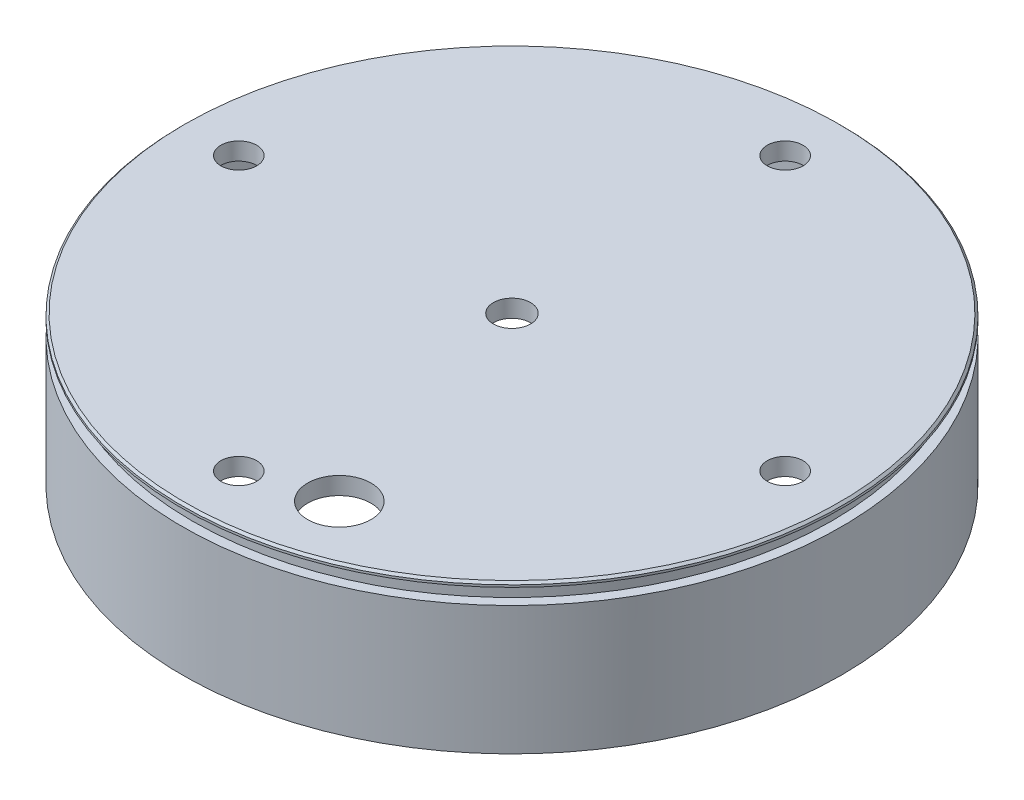
ISO-10303-21;
HEADER;
FILE_DESCRIPTION(('STEP AP214'),'2;1');
FILE_NAME('part.step','',(''),(''),'','','');
FILE_SCHEMA(('AUTOMOTIVE_DESIGN { 1 0 10303 214 1 1 1 1 }'));
ENDSEC;
DATA;
#1=APPLICATION_CONTEXT('core data for automotive mechanical design processes');
#2=APPLICATION_PROTOCOL_DEFINITION('international standard','automotive_design',2000,#1);
#3=PRODUCT_CONTEXT('',#1,'mechanical');
#4=PRODUCT('Part','Part','',(#3));
#5=PRODUCT_RELATED_PRODUCT_CATEGORY('part','',(#4));
#6=PRODUCT_DEFINITION_FORMATION('','',#4);
#7=PRODUCT_DEFINITION_CONTEXT('part definition',#1,'design');
#8=PRODUCT_DEFINITION('design','',#6,#7);
#9=PRODUCT_DEFINITION_SHAPE('','',#8);
#10=(LENGTH_UNIT() NAMED_UNIT(*) SI_UNIT(.MILLI.,.METRE.));
#11=(NAMED_UNIT(*) PLANE_ANGLE_UNIT() SI_UNIT($,.RADIAN.));
#12=(NAMED_UNIT(*) SI_UNIT($,.STERADIAN.) SOLID_ANGLE_UNIT());
#13=UNCERTAINTY_MEASURE_WITH_UNIT(LENGTH_MEASURE(1.E-05),#10,'distance_accuracy_value','');
#14=(GEOMETRIC_REPRESENTATION_CONTEXT(3) GLOBAL_UNCERTAINTY_ASSIGNED_CONTEXT((#13)) GLOBAL_UNIT_ASSIGNED_CONTEXT((#10,
#11,#12)) REPRESENTATION_CONTEXT('',''));
#15=CARTESIAN_POINT('',(0.,0.,0.));
#16=DIRECTION('',(0.,0.,1.));
#17=DIRECTION('',(1.,0.,0.));
#18=AXIS2_PLACEMENT_3D('',#15,#16,#17);
#19=CARTESIAN_POINT('',(0.,-30.,0.));
#20=DIRECTION('',(0.,1.,0.));
#21=DIRECTION('',(1.,0.,0.));
#22=AXIS2_PLACEMENT_3D('',#19,#20,#21);
#23=PLANE('',#22);
#24=CARTESIAN_POINT('',(0.,-30.,0.));
#25=DIRECTION('',(0.,1.,0.));
#26=DIRECTION('',(-1.,0.,0.));
#27=AXIS2_PLACEMENT_3D('',#24,#25,#26);
#28=CIRCLE('',#27,73.39);
#29=CARTESIAN_POINT('',(73.39,-30.,0.));
#30=VERTEX_POINT('',#29);
#31=EDGE_CURVE('E11',#30,#30,#28,.T.);
#32=ORIENTED_EDGE('',*,*,#31,.T.);
#33=EDGE_LOOP('',(#32));
#34=FACE_BOUND('',#33,.T.);
#35=CARTESIAN_POINT('',(0.,-30.,0.));
#36=DIRECTION('',(0.,-1.,0.));
#37=DIRECTION('',(-1.,0.,0.));
#38=AXIS2_PLACEMENT_3D('',#35,#36,#37);
#39=CIRCLE('',#38,75.39);
#40=CARTESIAN_POINT('',(75.39,-30.,0.));
#41=VERTEX_POINT('',#40);
#42=CARTESIAN_POINT('',(-75.39,-30.,0.));
#43=VERTEX_POINT('',#42);
#44=EDGE_CURVE('E178',#41,#43,#39,.T.);
#45=ORIENTED_EDGE('',*,*,#44,.T.);
#46=CARTESIAN_POINT('',(0.,-30.,0.));
#47=DIRECTION('',(0.,-1.,0.));
#48=DIRECTION('',(-1.,0.,0.));
#49=AXIS2_PLACEMENT_3D('',#46,#47,#48);
#50=CIRCLE('',#49,75.39);
#51=EDGE_CURVE('E169',#43,#41,#50,.T.);
#52=ORIENTED_EDGE('',*,*,#51,.T.);
#53=EDGE_LOOP('',(#45,#52));
#54=FACE_BOUND('',#53,.T.);
#55=ADVANCED_FACE('F16',(#34,#54),#23,.F.);
#56=CARTESIAN_POINT('',(0.,0.,0.));
#57=DIRECTION('',(0.,1.,0.));
#58=DIRECTION('',(1.,0.,0.));
#59=AXIS2_PLACEMENT_3D('',#56,#57,#58);
#60=PLANE('',#59);
#61=CARTESIAN_POINT('',(0.,0.,0.));
#62=DIRECTION('',(0.,1.,0.));
#63=DIRECTION('',(1.,0.,0.));
#64=AXIS2_PLACEMENT_3D('',#61,#62,#63);
#65=CIRCLE('',#64,4.25);
#66=CARTESIAN_POINT('',(4.25,0.,0.));
#67=VERTEX_POINT('',#66);
#68=CARTESIAN_POINT('',(-4.25,0.,0.));
#69=VERTEX_POINT('',#68);
#70=EDGE_CURVE('E255',#67,#69,#65,.T.);
#71=ORIENTED_EDGE('',*,*,#70,.T.);
#72=CARTESIAN_POINT('',(0.,0.,0.));
#73=DIRECTION('',(0.,1.,0.));
#74=DIRECTION('',(1.,0.,0.));
#75=AXIS2_PLACEMENT_3D('',#72,#73,#74);
#76=CIRCLE('',#75,4.25);
#77=EDGE_CURVE('E301',#69,#67,#76,.T.);
#78=ORIENTED_EDGE('',*,*,#77,.T.);
#79=EDGE_LOOP('',(#71,#78));
#80=FACE_BOUND('',#79,.T.);
#81=CARTESIAN_POINT('',(0.,0.,-62.5));
#82=DIRECTION('',(0.,1.,0.));
#83=DIRECTION('',(1.,0.,0.));
#84=AXIS2_PLACEMENT_3D('',#81,#82,#83);
#85=CIRCLE('',#84,4.1);
#86=CARTESIAN_POINT('',(-4.1,0.,-62.5));
#87=VERTEX_POINT('',#86);
#88=EDGE_CURVE('E252',#87,#87,#85,.T.);
#89=ORIENTED_EDGE('',*,*,#88,.T.);
#90=EDGE_LOOP('',(#89));
#91=FACE_BOUND('',#90,.T.);
#92=CARTESIAN_POINT('',(-62.5,0.,0.));
#93=DIRECTION('',(0.,1.,0.));
#94=DIRECTION('',(0.,0.,-1.));
#95=AXIS2_PLACEMENT_3D('',#92,#93,#94);
#96=CIRCLE('',#95,4.1);
#97=CARTESIAN_POINT('',(-62.5,0.,4.1));
#98=VERTEX_POINT('',#97);
#99=EDGE_CURVE('E243',#98,#98,#96,.T.);
#100=ORIENTED_EDGE('',*,*,#99,.T.);
#101=EDGE_LOOP('',(#100));
#102=FACE_BOUND('',#101,.T.);
#103=CARTESIAN_POINT('',(0.,0.,62.5));
#104=DIRECTION('',(0.,1.,0.));
#105=DIRECTION('',(-1.,0.,0.));
#106=AXIS2_PLACEMENT_3D('',#103,#104,#105);
#107=CIRCLE('',#106,4.1);
#108=CARTESIAN_POINT('',(4.1,0.,62.5));
#109=VERTEX_POINT('',#108);
#110=EDGE_CURVE('E73',#109,#109,#107,.T.);
#111=ORIENTED_EDGE('',*,*,#110,.T.);
#112=EDGE_LOOP('',(#111));
#113=FACE_BOUND('',#112,.T.);
#114=CARTESIAN_POINT('',(62.5,0.,0.));
#115=DIRECTION('',(0.,1.,0.));
#116=DIRECTION('',(0.,0.,1.));
#117=AXIS2_PLACEMENT_3D('',#114,#115,#116);
#118=CIRCLE('',#117,4.1);
#119=CARTESIAN_POINT('',(62.5,0.,-4.1));
#120=VERTEX_POINT('',#119);
#121=EDGE_CURVE('E227',#120,#120,#118,.T.);
#122=ORIENTED_EDGE('',*,*,#121,.T.);
#123=EDGE_LOOP('',(#122));
#124=FACE_BOUND('',#123,.T.);
#125=CARTESIAN_POINT('',(17.5,0.,57.));
#126=DIRECTION('',(0.,1.,0.));
#127=DIRECTION('',(-1.,0.,0.));
#128=AXIS2_PLACEMENT_3D('',#125,#126,#127);
#129=CIRCLE('',#128,7.25);
#130=CARTESIAN_POINT('',(24.75,0.,57.));
#131=VERTEX_POINT('',#130);
#132=EDGE_CURVE('E315',#131,#131,#129,.T.);
#133=ORIENTED_EDGE('',*,*,#132,.T.);
#134=EDGE_LOOP('',(#133));
#135=FACE_BOUND('',#134,.T.);
#136=CARTESIAN_POINT('',(0.,0.,0.));
#137=DIRECTION('',(0.,1.,0.));
#138=DIRECTION('',(-1.,0.,0.));
#139=AXIS2_PLACEMENT_3D('',#136,#137,#138);
#140=CIRCLE('',#139,70.39);
#141=CARTESIAN_POINT('',(70.39,0.,0.));
#142=VERTEX_POINT('',#141);
#143=EDGE_CURVE('E180',#142,#142,#140,.T.);
#144=ORIENTED_EDGE('',*,*,#143,.F.);
#145=EDGE_LOOP('',(#144));
#146=FACE_BOUND('',#145,.T.);
#147=ADVANCED_FACE('F330',(#80,#91,#102,#113,#124,#135,#146),#60,.F.);
#148=CARTESIAN_POINT('',(0.,0.,0.));
#149=DIRECTION('',(0.,-1.,0.));
#150=DIRECTION('',(-1.,0.,0.));
#151=AXIS2_PLACEMENT_3D('',#148,#149,#150);
#152=CYLINDRICAL_SURFACE('',#151,73.39);
#153=CARTESIAN_POINT('',(0.,-3.,0.));
#154=DIRECTION('',(0.,-1.,0.));
#155=DIRECTION('',(-1.,0.,0.));
#156=AXIS2_PLACEMENT_3D('',#153,#154,#155);
#157=CIRCLE('',#156,73.39);
#158=CARTESIAN_POINT('',(73.39,-3.,0.));
#159=VERTEX_POINT('',#158);
#160=EDGE_CURVE('E237',#159,#159,#157,.T.);
#161=ORIENTED_EDGE('',*,*,#160,.F.);
#162=DIRECTION('',(0.,-1.,0.));
#163=VECTOR('',#162,1.);
#164=CARTESIAN_POINT('',(73.39,0.,0.));
#165=LINE('',#164,#163);
#166=EDGE_CURVE('E27',#159,#30,#165,.T.);
#167=ORIENTED_EDGE('',*,*,#166,.T.);
#168=ORIENTED_EDGE('',*,*,#31,.F.);
#169=ORIENTED_EDGE('',*,*,#166,.F.);
#170=EDGE_LOOP('',(#161,#167,#168,#169));
#171=FACE_BOUND('',#170,.T.);
#172=ADVANCED_FACE('F18',(#171),#152,.F.);
#173=CARTESIAN_POINT('',(0.,-1.5,0.));
#174=DIRECTION('',(0.,-1.,0.));
#175=DIRECTION('',(-1.,0.,0.));
#176=AXIS2_PLACEMENT_3D('',#173,#174,#175);
#177=CONICAL_SURFACE('',#176,71.89,0.785398163397448);
#178=ORIENTED_EDGE('',*,*,#143,.T.);
#179=DIRECTION('',(0.707106781186547,-0.707106781186548,0.));
#180=VECTOR('',#179,1.);
#181=CARTESIAN_POINT('',(71.89,-1.5,0.));
#182=LINE('',#181,#180);
#183=EDGE_CURVE('E233',#142,#159,#182,.T.);
#184=ORIENTED_EDGE('',*,*,#183,.T.);
#185=ORIENTED_EDGE('',*,*,#160,.T.);
#186=ORIENTED_EDGE('',*,*,#183,.F.);
#187=EDGE_LOOP('',(#178,#184,#185,#186));
#188=FACE_BOUND('',#187,.T.);
#189=ADVANCED_FACE('F340',(#188),#177,.F.);
#190=CARTESIAN_POINT('',(0.,4.,0.));
#191=DIRECTION('',(0.,1.,0.));
#192=DIRECTION('',(1.,0.,0.));
#193=AXIS2_PLACEMENT_3D('',#190,#191,#192);
#194=PLANE('',#193);
#195=CARTESIAN_POINT('',(0.,4.,0.));
#196=DIRECTION('',(0.,-1.,0.));
#197=DIRECTION('',(1.,0.,0.));
#198=AXIS2_PLACEMENT_3D('',#195,#196,#197);
#199=CIRCLE('',#198,4.25);
#200=CARTESIAN_POINT('',(-4.25,4.,0.));
#201=VERTEX_POINT('',#200);
#202=EDGE_CURVE('E263',#201,#201,#199,.T.);
#203=ORIENTED_EDGE('',*,*,#202,.T.);
#204=EDGE_LOOP('',(#203));
#205=FACE_BOUND('',#204,.T.);
#206=CARTESIAN_POINT('',(0.,4.,-62.5));
#207=DIRECTION('',(0.,-1.,0.));
#208=DIRECTION('',(1.,0.,0.));
#209=AXIS2_PLACEMENT_3D('',#206,#207,#208);
#210=CIRCLE('',#209,4.1);
#211=CARTESIAN_POINT('',(4.1,4.,-62.5));
#212=VERTEX_POINT('',#211);
#213=CARTESIAN_POINT('',(-4.1,4.,-62.5));
#214=VERTEX_POINT('',#213);
#215=EDGE_CURVE('E238',#212,#214,#210,.T.);
#216=ORIENTED_EDGE('',*,*,#215,.T.);
#217=CARTESIAN_POINT('',(0.,4.,-62.5));
#218=DIRECTION('',(0.,-1.,0.));
#219=DIRECTION('',(1.,0.,0.));
#220=AXIS2_PLACEMENT_3D('',#217,#218,#219);
#221=CIRCLE('',#220,4.1);
#222=EDGE_CURVE('E242',#214,#212,#221,.T.);
#223=ORIENTED_EDGE('',*,*,#222,.T.);
#224=EDGE_LOOP('',(#216,#223));
#225=FACE_BOUND('',#224,.T.);
#226=CARTESIAN_POINT('',(-62.5,4.,0.));
#227=DIRECTION('',(0.,-1.,0.));
#228=DIRECTION('',(0.,0.,-1.));
#229=AXIS2_PLACEMENT_3D('',#226,#227,#228);
#230=CIRCLE('',#229,4.1);
#231=CARTESIAN_POINT('',(-62.5,4.,-4.1));
#232=VERTEX_POINT('',#231);
#233=CARTESIAN_POINT('',(-62.5,4.,4.1));
#234=VERTEX_POINT('',#233);
#235=EDGE_CURVE('E197',#232,#234,#230,.T.);
#236=ORIENTED_EDGE('',*,*,#235,.T.);
#237=CARTESIAN_POINT('',(-62.5,4.,0.));
#238=DIRECTION('',(0.,-1.,0.));
#239=DIRECTION('',(0.,0.,-1.));
#240=AXIS2_PLACEMENT_3D('',#237,#238,#239);
#241=CIRCLE('',#240,4.1);
#242=EDGE_CURVE('E60',#234,#232,#241,.T.);
#243=ORIENTED_EDGE('',*,*,#242,.T.);
#244=EDGE_LOOP('',(#236,#243));
#245=FACE_BOUND('',#244,.T.);
#246=CARTESIAN_POINT('',(0.,4.,62.5));
#247=DIRECTION('',(0.,-1.,0.));
#248=DIRECTION('',(-1.,0.,0.));
#249=AXIS2_PLACEMENT_3D('',#246,#247,#248);
#250=CIRCLE('',#249,4.1);
#251=CARTESIAN_POINT('',(-4.1,4.,62.5));
#252=VERTEX_POINT('',#251);
#253=CARTESIAN_POINT('',(4.1,4.,62.5));
#254=VERTEX_POINT('',#253);
#255=EDGE_CURVE('E214',#252,#254,#250,.T.);
#256=ORIENTED_EDGE('',*,*,#255,.T.);
#257=CARTESIAN_POINT('',(0.,4.,62.5));
#258=DIRECTION('',(0.,-1.,0.));
#259=DIRECTION('',(-1.,0.,0.));
#260=AXIS2_PLACEMENT_3D('',#257,#258,#259);
#261=CIRCLE('',#260,4.1);
#262=EDGE_CURVE('E210',#254,#252,#261,.T.);
#263=ORIENTED_EDGE('',*,*,#262,.T.);
#264=EDGE_LOOP('',(#256,#263));
#265=FACE_BOUND('',#264,.T.);
#266=CARTESIAN_POINT('',(62.5,4.,0.));
#267=DIRECTION('',(0.,-1.,0.));
#268=DIRECTION('',(0.,0.,1.));
#269=AXIS2_PLACEMENT_3D('',#266,#267,#268);
#270=CIRCLE('',#269,4.1);
#271=CARTESIAN_POINT('',(62.5,4.,4.1));
#272=VERTEX_POINT('',#271);
#273=CARTESIAN_POINT('',(62.5,4.,-4.1));
#274=VERTEX_POINT('',#273);
#275=EDGE_CURVE('E199',#272,#274,#270,.T.);
#276=ORIENTED_EDGE('',*,*,#275,.T.);
#277=CARTESIAN_POINT('',(62.5,4.,0.));
#278=DIRECTION('',(0.,-1.,0.));
#279=DIRECTION('',(0.,0.,1.));
#280=AXIS2_PLACEMENT_3D('',#277,#278,#279);
#281=CIRCLE('',#280,4.1);
#282=EDGE_CURVE('E202',#274,#272,#281,.T.);
#283=ORIENTED_EDGE('',*,*,#282,.T.);
#284=EDGE_LOOP('',(#276,#283));
#285=FACE_BOUND('',#284,.T.);
#286=CARTESIAN_POINT('',(17.5,4.,57.));
#287=DIRECTION('',(0.,-1.,0.));
#288=DIRECTION('',(-1.,0.,0.));
#289=AXIS2_PLACEMENT_3D('',#286,#287,#288);
#290=CIRCLE('',#289,7.25);
#291=CARTESIAN_POINT('',(24.75,4.,57.));
#292=VERTEX_POINT('',#291);
#293=EDGE_CURVE('E203',#292,#292,#290,.T.);
#294=ORIENTED_EDGE('',*,*,#293,.T.);
#295=EDGE_LOOP('',(#294));
#296=FACE_BOUND('',#295,.T.);
#297=CARTESIAN_POINT('',(0.,4.,0.));
#298=DIRECTION('',(0.,-1.,0.));
#299=DIRECTION('',(1.,0.,0.));
#300=AXIS2_PLACEMENT_3D('',#297,#298,#299);
#301=CIRCLE('',#300,74.89);
#302=CARTESIAN_POINT('',(-74.89,4.,0.));
#303=VERTEX_POINT('',#302);
#304=EDGE_CURVE('E193',#303,#303,#301,.T.);
#305=ORIENTED_EDGE('',*,*,#304,.F.);
#306=EDGE_LOOP('',(#305));
#307=FACE_BOUND('',#306,.T.);
#308=ADVANCED_FACE('F337',(#205,#225,#245,#265,#285,#296,#307),#194,.T.);
#309=CARTESIAN_POINT('',(0.,0.,0.));
#310=DIRECTION('',(0.,1.,0.));
#311=DIRECTION('',(1.,0.,0.));
#312=AXIS2_PLACEMENT_3D('',#309,#310,#311);
#313=CYLINDRICAL_SURFACE('',#312,75.39);
#314=CARTESIAN_POINT('',(0.,-0.6,0.));
#315=DIRECTION('',(0.,-1.,0.));
#316=DIRECTION('',(1.,0.,0.));
#317=AXIS2_PLACEMENT_3D('',#314,#315,#316);
#318=CIRCLE('',#317,75.39);
#319=CARTESIAN_POINT('',(0.,-0.6,-75.39));
#320=VERTEX_POINT('',#319);
#321=CARTESIAN_POINT('',(-75.39,-0.6,0.));
#322=VERTEX_POINT('',#321);
#323=EDGE_CURVE('E185',#320,#322,#318,.T.);
#324=ORIENTED_EDGE('',*,*,#323,.T.);
#325=DIRECTION('',(0.,-1.,0.));
#326=VECTOR('',#325,1.);
#327=CARTESIAN_POINT('',(-75.39,0.,0.));
#328=LINE('',#327,#326);
#329=EDGE_CURVE('E176',#322,#43,#328,.T.);
#330=ORIENTED_EDGE('',*,*,#329,.T.);
#331=ORIENTED_EDGE('',*,*,#44,.F.);
#332=ORIENTED_EDGE('',*,*,#51,.F.);
#333=ORIENTED_EDGE('',*,*,#329,.F.);
#334=CARTESIAN_POINT('',(0.,-0.6,0.));
#335=DIRECTION('',(0.,-1.,0.));
#336=DIRECTION('',(1.,0.,0.));
#337=AXIS2_PLACEMENT_3D('',#334,#335,#336);
#338=CIRCLE('',#337,75.39);
#339=EDGE_CURVE('E209',#322,#320,#338,.T.);
#340=ORIENTED_EDGE('',*,*,#339,.T.);
#341=EDGE_LOOP('',(#324,#330,#331,#332,#333,#340));
#342=FACE_BOUND('',#341,.T.);
#343=ADVANCED_FACE('F174',(#342),#313,.T.);
#344=CARTESIAN_POINT('',(0.,3.75,0.));
#345=DIRECTION('',(0.,-1.,0.));
#346=DIRECTION('',(1.,0.,0.));
#347=AXIS2_PLACEMENT_3D('',#344,#345,#346);
#348=CONICAL_SURFACE('',#347,75.14,0.785398163397447);
#349=ORIENTED_EDGE('',*,*,#304,.T.);
#350=DIRECTION('',(-0.707106781186546,-0.707106781186549,0.));
#351=VECTOR('',#350,1.);
#352=CARTESIAN_POINT('',(-75.14,3.75,0.));
#353=LINE('',#352,#351);
#354=CARTESIAN_POINT('',(-75.39,3.5,0.));
#355=VERTEX_POINT('',#354);
#356=EDGE_CURVE('E187',#303,#355,#353,.T.);
#357=ORIENTED_EDGE('',*,*,#356,.T.);
#358=CARTESIAN_POINT('',(0.,3.5,0.));
#359=DIRECTION('',(0.,1.,0.));
#360=DIRECTION('',(1.,0.,0.));
#361=AXIS2_PLACEMENT_3D('',#358,#359,#360);
#362=CIRCLE('',#361,75.39);
#363=EDGE_CURVE('E20',#355,#355,#362,.T.);
#364=ORIENTED_EDGE('',*,*,#363,.T.);
#365=ORIENTED_EDGE('',*,*,#356,.F.);
#366=EDGE_LOOP('',(#349,#357,#364,#365));
#367=FACE_BOUND('',#366,.T.);
#368=ADVANCED_FACE('F347',(#367),#348,.T.);
#369=CARTESIAN_POINT('',(0.,0.,0.));
#370=DIRECTION('',(0.,1.,0.));
#371=DIRECTION('',(1.,0.,0.));
#372=AXIS2_PLACEMENT_3D('',#369,#370,#371);
#373=CYLINDRICAL_SURFACE('',#372,75.39);
#374=ORIENTED_EDGE('',*,*,#363,.F.);
#375=DIRECTION('',(0.,-1.,0.));
#376=VECTOR('',#375,1.);
#377=CARTESIAN_POINT('',(-75.39,0.,0.));
#378=LINE('',#377,#376);
#379=CARTESIAN_POINT('',(-75.39,3.,0.));
#380=VERTEX_POINT('',#379);
#381=EDGE_CURVE('E220',#355,#380,#378,.T.);
#382=ORIENTED_EDGE('',*,*,#381,.T.);
#383=CARTESIAN_POINT('',(0.,3.,0.));
#384=DIRECTION('',(0.,1.,0.));
#385=DIRECTION('',(1.,0.,0.));
#386=AXIS2_PLACEMENT_3D('',#383,#384,#385);
#387=CIRCLE('',#386,75.39);
#388=CARTESIAN_POINT('',(0.,3.,-75.39));
#389=VERTEX_POINT('',#388);
#390=EDGE_CURVE('E215',#380,#389,#387,.T.);
#391=ORIENTED_EDGE('',*,*,#390,.T.);
#392=CARTESIAN_POINT('',(0.,3.,0.));
#393=DIRECTION('',(0.,1.,0.));
#394=DIRECTION('',(1.,0.,0.));
#395=AXIS2_PLACEMENT_3D('',#392,#393,#394);
#396=CIRCLE('',#395,75.39);
#397=EDGE_CURVE('E219',#389,#380,#396,.T.);
#398=ORIENTED_EDGE('',*,*,#397,.T.);
#399=ORIENTED_EDGE('',*,*,#381,.F.);
#400=EDGE_LOOP('',(#374,#382,#391,#398,#399));
#401=FACE_BOUND('',#400,.T.);
#402=ADVANCED_FACE('F421',(#401),#373,.T.);
#403=CARTESIAN_POINT('',(0.,3.,-75.39));
#404=DIRECTION('',(0.,1.,0.));
#405=DIRECTION('',(1.,0.,0.));
#406=AXIS2_PLACEMENT_3D('',#403,#404,#405);
#407=PLANE('',#406);
#408=CARTESIAN_POINT('',(0.,3.,0.));
#409=DIRECTION('',(0.,-1.,0.));
#410=DIRECTION('',(1.,0.,0.));
#411=AXIS2_PLACEMENT_3D('',#408,#409,#410);
#412=CIRCLE('',#411,73.14);
#413=CARTESIAN_POINT('',(0.,3.,-73.14));
#414=VERTEX_POINT('',#413);
#415=CARTESIAN_POINT('',(0.,3.,73.14));
#416=VERTEX_POINT('',#415);
#417=EDGE_CURVE('E228',#414,#416,#412,.T.);
#418=ORIENTED_EDGE('',*,*,#417,.F.);
#419=CARTESIAN_POINT('',(0.,3.,0.));
#420=DIRECTION('',(0.,-1.,0.));
#421=DIRECTION('',(1.,0.,0.));
#422=AXIS2_PLACEMENT_3D('',#419,#420,#421);
#423=CIRCLE('',#422,73.14);
#424=EDGE_CURVE('E284',#416,#414,#423,.T.);
#425=ORIENTED_EDGE('',*,*,#424,.F.);
#426=EDGE_LOOP('',(#418,#425));
#427=FACE_BOUND('',#426,.T.);
#428=ORIENTED_EDGE('',*,*,#397,.F.);
#429=ORIENTED_EDGE('',*,*,#390,.F.);
#430=EDGE_LOOP('',(#428,#429));
#431=FACE_BOUND('',#430,.T.);
#432=ADVANCED_FACE('F360',(#427,#431),#407,.F.);
#433=CARTESIAN_POINT('',(0.,1.2,0.));
#434=DIRECTION('',(0.,-1.,0.));
#435=DIRECTION('',(0.,0.,-1.));
#436=AXIS2_PLACEMENT_3D('',#433,#434,#435);
#437=CYLINDRICAL_SURFACE('',#436,73.14);
#438=ORIENTED_EDGE('',*,*,#417,.T.);
#439=DIRECTION('',(0.,-1.,0.));
#440=VECTOR('',#439,1.);
#441=CARTESIAN_POINT('',(0.,1.2,73.14));
#442=LINE('',#441,#440);
#443=CARTESIAN_POINT('',(0.,-0.6,73.14));
#444=VERTEX_POINT('',#443);
#445=EDGE_CURVE('E232',#416,#444,#442,.T.);
#446=ORIENTED_EDGE('',*,*,#445,.T.);
#447=CARTESIAN_POINT('',(0.,-0.6,0.));
#448=DIRECTION('',(0.,-1.,0.));
#449=DIRECTION('',(1.,0.,0.));
#450=AXIS2_PLACEMENT_3D('',#447,#448,#449);
#451=CIRCLE('',#450,73.14);
#452=CARTESIAN_POINT('',(0.,-0.6,-73.14));
#453=VERTEX_POINT('',#452);
#454=EDGE_CURVE('E204',#453,#444,#451,.T.);
#455=ORIENTED_EDGE('',*,*,#454,.F.);
#456=CARTESIAN_POINT('',(0.,-0.6,0.));
#457=DIRECTION('',(0.,-1.,0.));
#458=DIRECTION('',(1.,0.,0.));
#459=AXIS2_PLACEMENT_3D('',#456,#457,#458);
#460=CIRCLE('',#459,73.14);
#461=EDGE_CURVE('E208',#444,#453,#460,.T.);
#462=ORIENTED_EDGE('',*,*,#461,.F.);
#463=ORIENTED_EDGE('',*,*,#445,.F.);
#464=ORIENTED_EDGE('',*,*,#424,.T.);
#465=EDGE_LOOP('',(#438,#446,#455,#462,#463,#464));
#466=FACE_BOUND('',#465,.T.);
#467=ADVANCED_FACE('F281',(#466),#437,.T.);
#468=CARTESIAN_POINT('',(0.,-0.6,-73.14));
#469=DIRECTION('',(0.,-1.,0.));
#470=DIRECTION('',(0.,0.,-1.));
#471=AXIS2_PLACEMENT_3D('',#468,#469,#470);
#472=PLANE('',#471);
#473=ORIENTED_EDGE('',*,*,#454,.T.);
#474=ORIENTED_EDGE('',*,*,#461,.T.);
#475=EDGE_LOOP('',(#473,#474));
#476=FACE_BOUND('',#475,.T.);
#477=ORIENTED_EDGE('',*,*,#323,.F.);
#478=ORIENTED_EDGE('',*,*,#339,.F.);
#479=EDGE_LOOP('',(#477,#478));
#480=FACE_BOUND('',#479,.T.);
#481=ADVANCED_FACE('F277',(#476,#480),#472,.F.);
#482=CARTESIAN_POINT('',(0.,215.928730834968,0.));
#483=DIRECTION('',(0.,-1.,0.));
#484=DIRECTION('',(1.,0.,0.));
#485=AXIS2_PLACEMENT_3D('',#482,#483,#484);
#486=CYLINDRICAL_SURFACE('',#485,4.25);
#487=ORIENTED_EDGE('',*,*,#70,.F.);
#488=ORIENTED_EDGE('',*,*,#77,.F.);
#489=DIRECTION('',(0.,1.,0.));
#490=VECTOR('',#489,1.);
#491=CARTESIAN_POINT('',(-4.25,215.928730834968,0.));
#492=LINE('',#491,#490);
#493=EDGE_CURVE('E266',#69,#201,#492,.T.);
#494=ORIENTED_EDGE('',*,*,#493,.T.);
#495=ORIENTED_EDGE('',*,*,#202,.F.);
#496=ORIENTED_EDGE('',*,*,#493,.F.);
#497=EDGE_LOOP('',(#487,#488,#494,#495,#496));
#498=FACE_BOUND('',#497,.T.);
#499=ADVANCED_FACE('F372',(#498),#486,.F.);
#500=CARTESIAN_POINT('',(0.,-3.99,-62.5));
#501=DIRECTION('',(0.,1.,0.));
#502=DIRECTION('',(1.,0.,0.));
#503=AXIS2_PLACEMENT_3D('',#500,#501,#502);
#504=CYLINDRICAL_SURFACE('',#503,4.1);
#505=ORIENTED_EDGE('',*,*,#215,.F.);
#506=ORIENTED_EDGE('',*,*,#222,.F.);
#507=DIRECTION('',(0.,-1.,0.));
#508=VECTOR('',#507,1.);
#509=CARTESIAN_POINT('',(-4.1,-3.99,-62.5));
#510=LINE('',#509,#508);
#511=EDGE_CURVE('E256',#214,#87,#510,.T.);
#512=ORIENTED_EDGE('',*,*,#511,.T.);
#513=ORIENTED_EDGE('',*,*,#88,.F.);
#514=ORIENTED_EDGE('',*,*,#511,.F.);
#515=EDGE_LOOP('',(#505,#506,#512,#513,#514));
#516=FACE_BOUND('',#515,.T.);
#517=ADVANCED_FACE('F367',(#516),#504,.F.);
#518=CARTESIAN_POINT('',(-62.5,-3.99,0.));
#519=DIRECTION('',(0.,1.,0.));
#520=DIRECTION('',(0.,0.,-1.));
#521=AXIS2_PLACEMENT_3D('',#518,#519,#520);
#522=CYLINDRICAL_SURFACE('',#521,4.1);
#523=ORIENTED_EDGE('',*,*,#235,.F.);
#524=ORIENTED_EDGE('',*,*,#242,.F.);
#525=DIRECTION('',(0.,-1.,0.));
#526=VECTOR('',#525,1.);
#527=CARTESIAN_POINT('',(-62.5,-3.99,4.1));
#528=LINE('',#527,#526);
#529=EDGE_CURVE('E258',#234,#98,#528,.T.);
#530=ORIENTED_EDGE('',*,*,#529,.T.);
#531=ORIENTED_EDGE('',*,*,#99,.F.);
#532=ORIENTED_EDGE('',*,*,#529,.F.);
#533=EDGE_LOOP('',(#523,#524,#530,#531,#532));
#534=FACE_BOUND('',#533,.T.);
#535=ADVANCED_FACE('F371',(#534),#522,.F.);
#536=CARTESIAN_POINT('',(0.,-3.99,62.5));
#537=DIRECTION('',(0.,1.,0.));
#538=DIRECTION('',(-1.,0.,0.));
#539=AXIS2_PLACEMENT_3D('',#536,#537,#538);
#540=CYLINDRICAL_SURFACE('',#539,4.1);
#541=ORIENTED_EDGE('',*,*,#255,.F.);
#542=ORIENTED_EDGE('',*,*,#262,.F.);
#543=DIRECTION('',(0.,-1.,0.));
#544=VECTOR('',#543,1.);
#545=CARTESIAN_POINT('',(4.1,-3.99,62.5));
#546=LINE('',#545,#544);
#547=EDGE_CURVE('E213',#254,#109,#546,.T.);
#548=ORIENTED_EDGE('',*,*,#547,.T.);
#549=ORIENTED_EDGE('',*,*,#110,.F.);
#550=ORIENTED_EDGE('',*,*,#547,.F.);
#551=EDGE_LOOP('',(#541,#542,#548,#549,#550));
#552=FACE_BOUND('',#551,.T.);
#553=ADVANCED_FACE('F378',(#552),#540,.F.);
#554=CARTESIAN_POINT('',(62.5,-3.99,0.));
#555=DIRECTION('',(0.,1.,0.));
#556=DIRECTION('',(0.,0.,1.));
#557=AXIS2_PLACEMENT_3D('',#554,#555,#556);
#558=CYLINDRICAL_SURFACE('',#557,4.1);
#559=ORIENTED_EDGE('',*,*,#275,.F.);
#560=ORIENTED_EDGE('',*,*,#282,.F.);
#561=DIRECTION('',(0.,-1.,0.));
#562=VECTOR('',#561,1.);
#563=CARTESIAN_POINT('',(62.5,-3.99,-4.1));
#564=LINE('',#563,#562);
#565=EDGE_CURVE('E223',#274,#120,#564,.T.);
#566=ORIENTED_EDGE('',*,*,#565,.T.);
#567=ORIENTED_EDGE('',*,*,#121,.F.);
#568=ORIENTED_EDGE('',*,*,#565,.F.);
#569=EDGE_LOOP('',(#559,#560,#566,#567,#568));
#570=FACE_BOUND('',#569,.T.);
#571=ADVANCED_FACE('F334',(#570),#558,.F.);
#572=CARTESIAN_POINT('',(17.5,0.,57.));
#573=DIRECTION('',(0.,1.,0.));
#574=DIRECTION('',(-1.,0.,0.));
#575=AXIS2_PLACEMENT_3D('',#572,#573,#574);
#576=CYLINDRICAL_SURFACE('',#575,7.25);
#577=ORIENTED_EDGE('',*,*,#132,.F.);
#578=DIRECTION('',(0.,1.,0.));
#579=VECTOR('',#578,1.);
#580=CARTESIAN_POINT('',(24.75,0.,57.));
#581=LINE('',#580,#579);
#582=EDGE_CURVE('E251',#131,#292,#581,.T.);
#583=ORIENTED_EDGE('',*,*,#582,.T.);
#584=ORIENTED_EDGE('',*,*,#293,.F.);
#585=ORIENTED_EDGE('',*,*,#582,.F.);
#586=EDGE_LOOP('',(#577,#583,#584,#585));
#587=FACE_BOUND('',#586,.T.);
#588=ADVANCED_FACE('F405',(#587),#576,.F.);
#589=CLOSED_SHELL('',(#55,#147,#172,#189,#308,#343,#368,#402,#432,#467,#481,#499,#517,#535,#553,
#571,#588));
#590=MANIFOLD_SOLID_BREP('B1',#589);
#591=ADVANCED_BREP_SHAPE_REPRESENTATION('',(#18,#590),#14);
#592=SHAPE_DEFINITION_REPRESENTATION(#9,#591);
ENDSEC;
END-ISO-10303-21;
